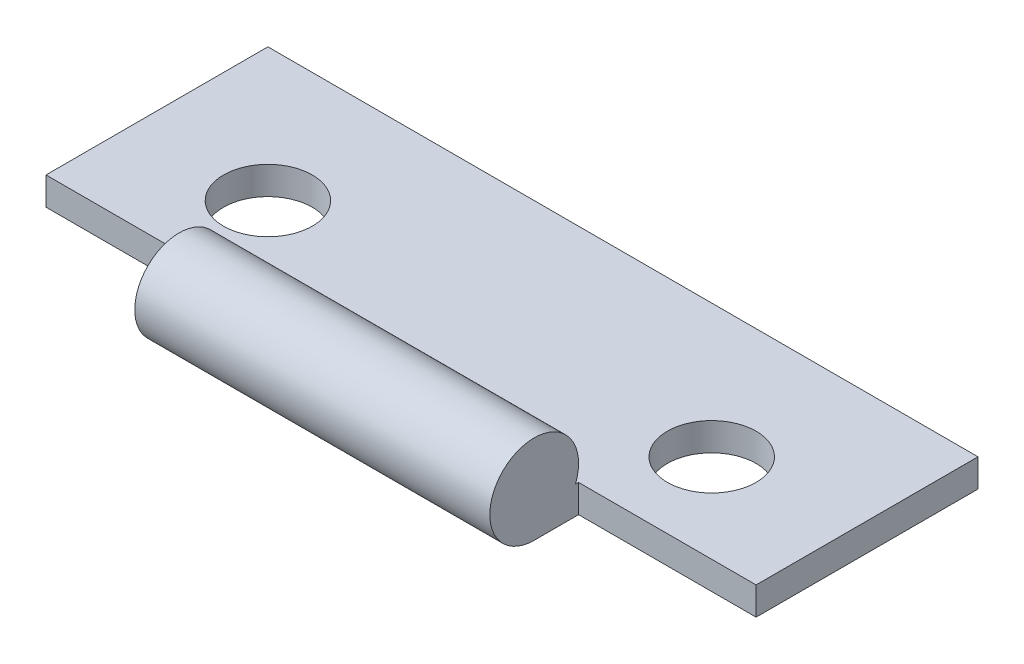
ISO-10303-21;
HEADER;
FILE_DESCRIPTION(('STEP AP214'),'2;1');
FILE_NAME('part.step','',(''),(''),'','','');
FILE_SCHEMA(('AUTOMOTIVE_DESIGN { 1 0 10303 214 1 1 1 1 }'));
ENDSEC;
DATA;
#1=APPLICATION_CONTEXT('core data for automotive mechanical design processes');
#2=APPLICATION_PROTOCOL_DEFINITION('international standard','automotive_design',2000,#1);
#3=PRODUCT_CONTEXT('',#1,'mechanical');
#4=PRODUCT('Part','Part','',(#3));
#5=PRODUCT_RELATED_PRODUCT_CATEGORY('part','',(#4));
#6=PRODUCT_DEFINITION_FORMATION('','',#4);
#7=PRODUCT_DEFINITION_CONTEXT('part definition',#1,'design');
#8=PRODUCT_DEFINITION('design','',#6,#7);
#9=PRODUCT_DEFINITION_SHAPE('','',#8);
#10=(LENGTH_UNIT() NAMED_UNIT(*) SI_UNIT(.MILLI.,.METRE.));
#11=(NAMED_UNIT(*) PLANE_ANGLE_UNIT() SI_UNIT($,.RADIAN.));
#12=(NAMED_UNIT(*) SI_UNIT($,.STERADIAN.) SOLID_ANGLE_UNIT());
#13=UNCERTAINTY_MEASURE_WITH_UNIT(LENGTH_MEASURE(1.E-05),#10,'distance_accuracy_value','');
#14=(GEOMETRIC_REPRESENTATION_CONTEXT(3) GLOBAL_UNCERTAINTY_ASSIGNED_CONTEXT((#13)) GLOBAL_UNIT_ASSIGNED_CONTEXT((#10,
#11,#12)) REPRESENTATION_CONTEXT('',''));
#15=CARTESIAN_POINT('',(0.,0.,0.));
#16=DIRECTION('',(0.,0.,1.));
#17=DIRECTION('',(1.,0.,0.));
#18=AXIS2_PLACEMENT_3D('',#15,#16,#17);
#19=CARTESIAN_POINT('',(0.,1.,0.));
#20=DIRECTION('',(0.,1.,0.));
#21=DIRECTION('',(0.,0.,1.));
#22=AXIS2_PLACEMENT_3D('',#19,#20,#21);
#23=PLANE('',#22);
#24=DIRECTION('',(-1.,0.,0.));
#25=VECTOR('',#24,1.);
#26=CARTESIAN_POINT('',(19.05,1.,-1.47478812037527));
#27=LINE('',#26,#25);
#28=CARTESIAN_POINT('',(19.05,1.,-1.47478812037527));
#29=VERTEX_POINT('',#28);
#30=CARTESIAN_POINT('',(6.35,1.,-1.47478812037526));
#31=VERTEX_POINT('',#30);
#32=EDGE_CURVE('E52',#29,#31,#27,.T.);
#33=ORIENTED_EDGE('',*,*,#32,.F.);
#34=DIRECTION('',(0.,0.,-1.));
#35=VECTOR('',#34,1.);
#36=CARTESIAN_POINT('',(19.05,1.,-1.58750000000001));
#37=LINE('',#36,#35);
#38=CARTESIAN_POINT('',(19.05,1.,-1.58750000000001));
#39=VERTEX_POINT('',#38);
#40=EDGE_CURVE('E135',#29,#39,#37,.T.);
#41=ORIENTED_EDGE('',*,*,#40,.T.);
#42=DIRECTION('',(1.,0.,0.));
#43=VECTOR('',#42,1.);
#44=CARTESIAN_POINT('',(25.4,1.,-1.58750000000001));
#45=LINE('',#44,#43);
#46=CARTESIAN_POINT('',(25.4,1.,-1.58750000000001));
#47=VERTEX_POINT('',#46);
#48=EDGE_CURVE('E138',#39,#47,#45,.T.);
#49=ORIENTED_EDGE('',*,*,#48,.T.);
#50=DIRECTION('',(0.,0.,-1.));
#51=VECTOR('',#50,1.);
#52=CARTESIAN_POINT('',(25.4,1.,-9.525));
#53=LINE('',#52,#51);
#54=CARTESIAN_POINT('',(25.4,1.,-9.525));
#55=VERTEX_POINT('',#54);
#56=EDGE_CURVE('E140',#47,#55,#53,.T.);
#57=ORIENTED_EDGE('',*,*,#56,.T.);
#58=DIRECTION('',(-1.,0.,0.));
#59=VECTOR('',#58,1.);
#60=CARTESIAN_POINT('',(0.,1.,-9.525));
#61=LINE('',#60,#59);
#62=CARTESIAN_POINT('',(0.,1.,-9.525));
#63=VERTEX_POINT('',#62);
#64=EDGE_CURVE('E142',#55,#63,#61,.T.);
#65=ORIENTED_EDGE('',*,*,#64,.T.);
#66=DIRECTION('',(0.,0.,1.));
#67=VECTOR('',#66,1.);
#68=CARTESIAN_POINT('',(0.,1.,-9.525));
#69=LINE('',#68,#67);
#70=CARTESIAN_POINT('',(0.,1.,-1.5875));
#71=VERTEX_POINT('',#70);
#72=EDGE_CURVE('E144',#63,#71,#69,.T.);
#73=ORIENTED_EDGE('',*,*,#72,.T.);
#74=DIRECTION('',(1.,0.,0.));
#75=VECTOR('',#74,1.);
#76=CARTESIAN_POINT('',(0.,1.,-1.5875));
#77=LINE('',#76,#75);
#78=CARTESIAN_POINT('',(6.35,1.,-1.5875));
#79=VERTEX_POINT('',#78);
#80=EDGE_CURVE('E146',#71,#79,#77,.T.);
#81=ORIENTED_EDGE('',*,*,#80,.T.);
#82=DIRECTION('',(0.,0.,1.));
#83=VECTOR('',#82,1.);
#84=CARTESIAN_POINT('',(6.35,1.,-1.5875));
#85=LINE('',#84,#83);
#86=EDGE_CURVE('E48',#79,#31,#85,.T.);
#87=ORIENTED_EDGE('',*,*,#86,.T.);
#88=EDGE_LOOP('',(#33,#41,#49,#57,#65,#73,#81,#87));
#89=FACE_BOUND('',#88,.T.);
#90=CARTESIAN_POINT('',(4.7625,1.,-4.7625));
#91=DIRECTION('',(0.,1.,0.));
#92=DIRECTION('',(0.,0.,1.));
#93=AXIS2_PLACEMENT_3D('',#90,#91,#92);
#94=CIRCLE('',#93,1.5875);
#95=CARTESIAN_POINT('',(4.7625,1.,-3.175));
#96=VERTEX_POINT('',#95);
#97=EDGE_CURVE('E106',#96,#96,#94,.T.);
#98=ORIENTED_EDGE('',*,*,#97,.F.);
#99=EDGE_LOOP('',(#98));
#100=FACE_BOUND('',#99,.T.);
#101=CARTESIAN_POINT('',(20.6375,1.,-4.7625));
#102=DIRECTION('',(0.,1.,0.));
#103=DIRECTION('',(0.,0.,-1.));
#104=AXIS2_PLACEMENT_3D('',#101,#102,#103);
#105=CIRCLE('',#104,1.5875);
#106=CARTESIAN_POINT('',(20.6375,1.,-6.35000000000001));
#107=VERTEX_POINT('',#106);
#108=EDGE_CURVE('E124',#107,#107,#105,.T.);
#109=ORIENTED_EDGE('',*,*,#108,.F.);
#110=EDGE_LOOP('',(#109));
#111=FACE_BOUND('',#110,.T.);
#112=ADVANCED_FACE('F33',(#89,#100,#111),#23,.T.);
#113=CARTESIAN_POINT('',(0.,0.,0.));
#114=DIRECTION('',(0.,1.,0.));
#115=DIRECTION('',(0.,0.,1.));
#116=AXIS2_PLACEMENT_3D('',#113,#114,#115);
#117=PLANE('',#116);
#118=DIRECTION('',(0.,0.,1.));
#119=VECTOR('',#118,1.);
#120=CARTESIAN_POINT('',(6.35,0.,-1.5875));
#121=LINE('',#120,#119);
#122=CARTESIAN_POINT('',(6.35,0.,-1.5875));
#123=VERTEX_POINT('',#122);
#124=CARTESIAN_POINT('',(6.35,0.,0.));
#125=VERTEX_POINT('',#124);
#126=EDGE_CURVE('E97',#123,#125,#121,.T.);
#127=ORIENTED_EDGE('',*,*,#126,.F.);
#128=DIRECTION('',(1.,0.,0.));
#129=VECTOR('',#128,1.);
#130=CARTESIAN_POINT('',(0.,0.,-1.5875));
#131=LINE('',#130,#129);
#132=CARTESIAN_POINT('',(0.,0.,-1.5875));
#133=VERTEX_POINT('',#132);
#134=EDGE_CURVE('E136',#133,#123,#131,.T.);
#135=ORIENTED_EDGE('',*,*,#134,.F.);
#136=DIRECTION('',(0.,0.,1.));
#137=VECTOR('',#136,1.);
#138=CARTESIAN_POINT('',(0.,0.,-9.525));
#139=LINE('',#138,#137);
#140=CARTESIAN_POINT('',(0.,0.,-9.525));
#141=VERTEX_POINT('',#140);
#142=EDGE_CURVE('E155',#141,#133,#139,.T.);
#143=ORIENTED_EDGE('',*,*,#142,.F.);
#144=DIRECTION('',(-1.,0.,0.));
#145=VECTOR('',#144,1.);
#146=CARTESIAN_POINT('',(0.,0.,-9.525));
#147=LINE('',#146,#145);
#148=CARTESIAN_POINT('',(25.4,0.,-9.525));
#149=VERTEX_POINT('',#148);
#150=EDGE_CURVE('E153',#149,#141,#147,.T.);
#151=ORIENTED_EDGE('',*,*,#150,.F.);
#152=DIRECTION('',(0.,0.,-1.));
#153=VECTOR('',#152,1.);
#154=CARTESIAN_POINT('',(25.4,0.,-9.525));
#155=LINE('',#154,#153);
#156=CARTESIAN_POINT('',(25.4,0.,-1.58750000000001));
#157=VERTEX_POINT('',#156);
#158=EDGE_CURVE('E151',#157,#149,#155,.T.);
#159=ORIENTED_EDGE('',*,*,#158,.F.);
#160=DIRECTION('',(1.,0.,0.));
#161=VECTOR('',#160,1.);
#162=CARTESIAN_POINT('',(25.4,0.,-1.58750000000001));
#163=LINE('',#162,#161);
#164=CARTESIAN_POINT('',(19.05,0.,-1.58750000000001));
#165=VERTEX_POINT('',#164);
#166=EDGE_CURVE('E149',#165,#157,#163,.T.);
#167=ORIENTED_EDGE('',*,*,#166,.F.);
#168=DIRECTION('',(0.,0.,-1.));
#169=VECTOR('',#168,1.);
#170=CARTESIAN_POINT('',(19.05,0.,-1.58750000000001));
#171=LINE('',#170,#169);
#172=CARTESIAN_POINT('',(19.05,0.,0.));
#173=VERTEX_POINT('',#172);
#174=EDGE_CURVE('E112',#173,#165,#171,.T.);
#175=ORIENTED_EDGE('',*,*,#174,.F.);
#176=DIRECTION('',(1.,0.,0.));
#177=VECTOR('',#176,1.);
#178=CARTESIAN_POINT('',(6.35,0.,0.));
#179=LINE('',#178,#177);
#180=EDGE_CURVE('E105',#125,#173,#179,.T.);
#181=ORIENTED_EDGE('',*,*,#180,.F.);
#182=EDGE_LOOP('',(#127,#135,#143,#151,#159,#167,#175,#181));
#183=FACE_BOUND('',#182,.T.);
#184=CARTESIAN_POINT('',(4.7625,0.,-4.7625));
#185=DIRECTION('',(0.,1.,0.));
#186=DIRECTION('',(0.,0.,1.));
#187=AXIS2_PLACEMENT_3D('',#184,#185,#186);
#188=CIRCLE('',#187,1.5875);
#189=CARTESIAN_POINT('',(4.7625,0.,-3.175));
#190=VERTEX_POINT('',#189);
#191=EDGE_CURVE('E127',#190,#190,#188,.T.);
#192=ORIENTED_EDGE('',*,*,#191,.T.);
#193=EDGE_LOOP('',(#192));
#194=FACE_BOUND('',#193,.T.);
#195=CARTESIAN_POINT('',(20.6375,0.,-4.7625));
#196=DIRECTION('',(0.,1.,0.));
#197=DIRECTION('',(0.,0.,-1.));
#198=AXIS2_PLACEMENT_3D('',#195,#196,#197);
#199=CIRCLE('',#198,1.5875);
#200=CARTESIAN_POINT('',(20.6375,0.,-6.35000000000001));
#201=VERTEX_POINT('',#200);
#202=EDGE_CURVE('E123',#201,#201,#199,.T.);
#203=ORIENTED_EDGE('',*,*,#202,.T.);
#204=EDGE_LOOP('',(#203));
#205=FACE_BOUND('',#204,.T.);
#206=ADVANCED_FACE('F109',(#183,#194,#205),#117,.F.);
#207=CARTESIAN_POINT('',(6.35,1.,-1.5875));
#208=DIRECTION('',(1.,0.,0.));
#209=DIRECTION('',(0.,0.,-1.));
#210=AXIS2_PLACEMENT_3D('',#207,#208,#209);
#211=PLANE('',#210);
#212=ORIENTED_EDGE('',*,*,#126,.T.);
#213=CARTESIAN_POINT('',(6.35,1.5875,0.));
#214=DIRECTION('',(-1.,0.,0.));
#215=DIRECTION('',(0.,0.,1.));
#216=AXIS2_PLACEMENT_3D('',#213,#214,#215);
#217=CIRCLE('',#216,1.5875);
#218=EDGE_CURVE('E100',#125,#31,#217,.T.);
#219=ORIENTED_EDGE('',*,*,#218,.T.);
#220=ORIENTED_EDGE('',*,*,#86,.F.);
#221=DIRECTION('',(0.,-1.,0.));
#222=VECTOR('',#221,1.);
#223=CARTESIAN_POINT('',(6.35,1.,-1.5875));
#224=LINE('',#223,#222);
#225=EDGE_CURVE('E102',#79,#123,#224,.T.);
#226=ORIENTED_EDGE('',*,*,#225,.T.);
#227=EDGE_LOOP('',(#212,#219,#220,#226));
#228=FACE_BOUND('',#227,.T.);
#229=ADVANCED_FACE('F35',(#228),#211,.F.);
#230=CARTESIAN_POINT('',(19.05,1.,-1.58750000000001));
#231=DIRECTION('',(-1.,0.,0.));
#232=DIRECTION('',(0.,0.,1.));
#233=AXIS2_PLACEMENT_3D('',#230,#231,#232);
#234=PLANE('',#233);
#235=ORIENTED_EDGE('',*,*,#40,.F.);
#236=CARTESIAN_POINT('',(19.05,1.5875,0.));
#237=DIRECTION('',(-1.,0.,0.));
#238=DIRECTION('',(0.,0.,1.));
#239=AXIS2_PLACEMENT_3D('',#236,#237,#238);
#240=CIRCLE('',#239,1.5875);
#241=EDGE_CURVE('E118',#173,#29,#240,.T.);
#242=ORIENTED_EDGE('',*,*,#241,.F.);
#243=ORIENTED_EDGE('',*,*,#174,.T.);
#244=DIRECTION('',(0.,-1.,0.));
#245=VECTOR('',#244,1.);
#246=CARTESIAN_POINT('',(19.05,1.,-1.58750000000001));
#247=LINE('',#246,#245);
#248=EDGE_CURVE('E11',#39,#165,#247,.T.);
#249=ORIENTED_EDGE('',*,*,#248,.F.);
#250=EDGE_LOOP('',(#235,#242,#243,#249));
#251=FACE_BOUND('',#250,.T.);
#252=ADVANCED_FACE('F191',(#251),#234,.F.);
#253=CARTESIAN_POINT('',(25.4,1.,-1.58750000000001));
#254=DIRECTION('',(0.,0.,-1.));
#255=DIRECTION('',(-1.,0.,0.));
#256=AXIS2_PLACEMENT_3D('',#253,#254,#255);
#257=PLANE('',#256);
#258=ORIENTED_EDGE('',*,*,#166,.T.);
#259=DIRECTION('',(0.,-1.,0.));
#260=VECTOR('',#259,1.);
#261=CARTESIAN_POINT('',(25.4,1.,-1.58750000000001));
#262=LINE('',#261,#260);
#263=EDGE_CURVE('E41',#47,#157,#262,.T.);
#264=ORIENTED_EDGE('',*,*,#263,.F.);
#265=ORIENTED_EDGE('',*,*,#48,.F.);
#266=ORIENTED_EDGE('',*,*,#248,.T.);
#267=EDGE_LOOP('',(#258,#264,#265,#266));
#268=FACE_BOUND('',#267,.T.);
#269=ADVANCED_FACE('F189',(#268),#257,.F.);
#270=CARTESIAN_POINT('',(25.4,1.,-9.525));
#271=DIRECTION('',(-1.,0.,0.));
#272=DIRECTION('',(0.,0.,1.));
#273=AXIS2_PLACEMENT_3D('',#270,#271,#272);
#274=PLANE('',#273);
#275=ORIENTED_EDGE('',*,*,#158,.T.);
#276=DIRECTION('',(0.,-1.,0.));
#277=VECTOR('',#276,1.);
#278=CARTESIAN_POINT('',(25.4,1.,-9.525));
#279=LINE('',#278,#277);
#280=EDGE_CURVE('E165',#55,#149,#279,.T.);
#281=ORIENTED_EDGE('',*,*,#280,.F.);
#282=ORIENTED_EDGE('',*,*,#56,.F.);
#283=ORIENTED_EDGE('',*,*,#263,.T.);
#284=EDGE_LOOP('',(#275,#281,#282,#283));
#285=FACE_BOUND('',#284,.T.);
#286=ADVANCED_FACE('F172',(#285),#274,.F.);
#287=CARTESIAN_POINT('',(0.,1.,-9.525));
#288=DIRECTION('',(0.,0.,1.));
#289=DIRECTION('',(1.,0.,0.));
#290=AXIS2_PLACEMENT_3D('',#287,#288,#289);
#291=PLANE('',#290);
#292=ORIENTED_EDGE('',*,*,#150,.T.);
#293=DIRECTION('',(0.,-1.,0.));
#294=VECTOR('',#293,1.);
#295=CARTESIAN_POINT('',(0.,1.,-9.525));
#296=LINE('',#295,#294);
#297=EDGE_CURVE('E162',#63,#141,#296,.T.);
#298=ORIENTED_EDGE('',*,*,#297,.F.);
#299=ORIENTED_EDGE('',*,*,#64,.F.);
#300=ORIENTED_EDGE('',*,*,#280,.T.);
#301=EDGE_LOOP('',(#292,#298,#299,#300));
#302=FACE_BOUND('',#301,.T.);
#303=ADVANCED_FACE('F180',(#302),#291,.F.);
#304=CARTESIAN_POINT('',(0.,1.,-9.525));
#305=DIRECTION('',(1.,0.,0.));
#306=DIRECTION('',(0.,0.,-1.));
#307=AXIS2_PLACEMENT_3D('',#304,#305,#306);
#308=PLANE('',#307);
#309=ORIENTED_EDGE('',*,*,#142,.T.);
#310=DIRECTION('',(0.,-1.,0.));
#311=VECTOR('',#310,1.);
#312=CARTESIAN_POINT('',(0.,1.,-1.5875));
#313=LINE('',#312,#311);
#314=EDGE_CURVE('E159',#71,#133,#313,.T.);
#315=ORIENTED_EDGE('',*,*,#314,.F.);
#316=ORIENTED_EDGE('',*,*,#72,.F.);
#317=ORIENTED_EDGE('',*,*,#297,.T.);
#318=EDGE_LOOP('',(#309,#315,#316,#317));
#319=FACE_BOUND('',#318,.T.);
#320=ADVANCED_FACE('F184',(#319),#308,.F.);
#321=CARTESIAN_POINT('',(0.,1.,-1.5875));
#322=DIRECTION('',(0.,0.,-1.));
#323=DIRECTION('',(-1.,0.,0.));
#324=AXIS2_PLACEMENT_3D('',#321,#322,#323);
#325=PLANE('',#324);
#326=ORIENTED_EDGE('',*,*,#134,.T.);
#327=ORIENTED_EDGE('',*,*,#225,.F.);
#328=ORIENTED_EDGE('',*,*,#80,.F.);
#329=ORIENTED_EDGE('',*,*,#314,.T.);
#330=EDGE_LOOP('',(#326,#327,#328,#329));
#331=FACE_BOUND('',#330,.T.);
#332=ADVANCED_FACE('F208',(#331),#325,.F.);
#333=CARTESIAN_POINT('',(4.7625,1.,-4.7625));
#334=DIRECTION('',(0.,-1.,0.));
#335=DIRECTION('',(0.,0.,-1.));
#336=AXIS2_PLACEMENT_3D('',#333,#334,#335);
#337=CYLINDRICAL_SURFACE('',#336,1.5875);
#338=ORIENTED_EDGE('',*,*,#97,.T.);
#339=EDGE_LOOP('',(#338));
#340=FACE_BOUND('',#339,.T.);
#341=ORIENTED_EDGE('',*,*,#191,.F.);
#342=EDGE_LOOP('',(#341));
#343=FACE_BOUND('',#342,.T.);
#344=ADVANCED_FACE('F205',(#340,#343),#337,.F.);
#345=CARTESIAN_POINT('',(20.6375,1.,-4.7625));
#346=DIRECTION('',(0.,-1.,0.));
#347=DIRECTION('',(0.,0.,-1.));
#348=AXIS2_PLACEMENT_3D('',#345,#346,#347);
#349=CYLINDRICAL_SURFACE('',#348,1.5875);
#350=ORIENTED_EDGE('',*,*,#108,.T.);
#351=EDGE_LOOP('',(#350));
#352=FACE_BOUND('',#351,.T.);
#353=ORIENTED_EDGE('',*,*,#202,.F.);
#354=EDGE_LOOP('',(#353));
#355=FACE_BOUND('',#354,.T.);
#356=ADVANCED_FACE('F239',(#352,#355),#349,.F.);
#357=CARTESIAN_POINT('',(19.05,1.5875,0.));
#358=DIRECTION('',(-1.,0.,0.));
#359=DIRECTION('',(0.,0.,1.));
#360=AXIS2_PLACEMENT_3D('',#357,#358,#359);
#361=CYLINDRICAL_SURFACE('',#360,1.5875);
#362=ORIENTED_EDGE('',*,*,#241,.T.);
#363=ORIENTED_EDGE('',*,*,#32,.T.);
#364=ORIENTED_EDGE('',*,*,#218,.F.);
#365=ORIENTED_EDGE('',*,*,#180,.T.);
#366=EDGE_LOOP('',(#362,#363,#364,#365));
#367=FACE_BOUND('',#366,.T.);
#368=ADVANCED_FACE('F117',(#367),#361,.T.);
#369=CLOSED_SHELL('',(#112,#206,#229,#252,#269,#286,#303,#320,#332,#344,#356,#368));
#370=MANIFOLD_SOLID_BREP('B2',#369);
#371=ADVANCED_BREP_SHAPE_REPRESENTATION('',(#18,#370),#14);
#372=SHAPE_DEFINITION_REPRESENTATION(#9,#371);
ENDSEC;
END-ISO-10303-21;
